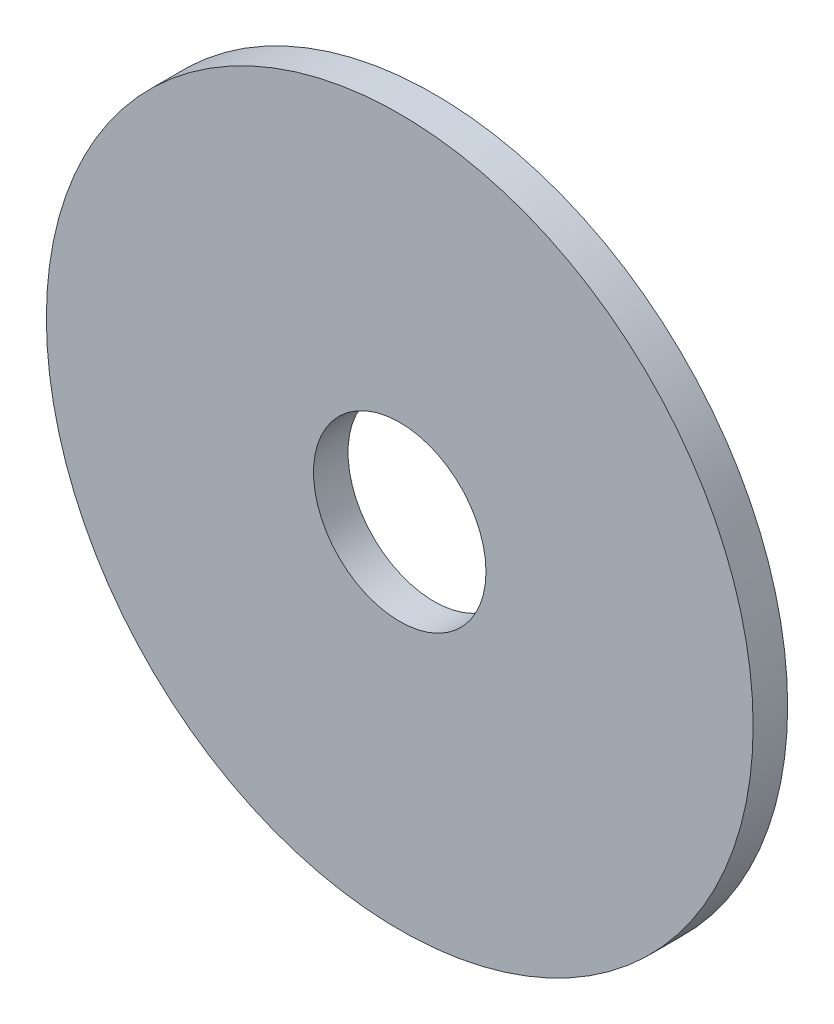
ISO-10303-21;
HEADER;
FILE_DESCRIPTION(('STEP AP214'),'2;1');
FILE_NAME('part.step','',(''),(''),'','','');
FILE_SCHEMA(('AUTOMOTIVE_DESIGN { 1 0 10303 214 1 1 1 1 }'));
ENDSEC;
DATA;
#1=APPLICATION_CONTEXT('core data for automotive mechanical design processes');
#2=APPLICATION_PROTOCOL_DEFINITION('international standard','automotive_design',2000,#1);
#3=PRODUCT_CONTEXT('',#1,'mechanical');
#4=PRODUCT('Part','Part','',(#3));
#5=PRODUCT_RELATED_PRODUCT_CATEGORY('part','',(#4));
#6=PRODUCT_DEFINITION_FORMATION('','',#4);
#7=PRODUCT_DEFINITION_CONTEXT('part definition',#1,'design');
#8=PRODUCT_DEFINITION('design','',#6,#7);
#9=PRODUCT_DEFINITION_SHAPE('','',#8);
#10=(LENGTH_UNIT() NAMED_UNIT(*) SI_UNIT(.MILLI.,.METRE.));
#11=(NAMED_UNIT(*) PLANE_ANGLE_UNIT() SI_UNIT($,.RADIAN.));
#12=(NAMED_UNIT(*) SI_UNIT($,.STERADIAN.) SOLID_ANGLE_UNIT());
#13=UNCERTAINTY_MEASURE_WITH_UNIT(LENGTH_MEASURE(1.E-05),#10,'distance_accuracy_value','');
#14=(GEOMETRIC_REPRESENTATION_CONTEXT(3) GLOBAL_UNCERTAINTY_ASSIGNED_CONTEXT((#13)) GLOBAL_UNIT_ASSIGNED_CONTEXT((#10,
#11,#12)) REPRESENTATION_CONTEXT('',''));
#15=CARTESIAN_POINT('',(0.,0.,0.));
#16=DIRECTION('',(0.,0.,1.));
#17=DIRECTION('',(1.,0.,0.));
#18=AXIS2_PLACEMENT_3D('',#15,#16,#17);
#19=CARTESIAN_POINT('',(0.,0.,-2.54));
#20=DIRECTION('',(0.,0.,-1.));
#21=DIRECTION('',(1.,0.,0.));
#22=AXIS2_PLACEMENT_3D('',#19,#20,#21);
#23=PLANE('',#22);
#24=CARTESIAN_POINT('',(0.,0.,-2.54));
#25=DIRECTION('',(0.,0.,1.));
#26=DIRECTION('',(1.,0.,0.));
#27=AXIS2_PLACEMENT_3D('',#24,#25,#26);
#28=CIRCLE('',#27,26.0223);
#29=CARTESIAN_POINT('',(26.0223,0.,-2.54));
#30=VERTEX_POINT('',#29);
#31=EDGE_CURVE('E10',#30,#30,#28,.T.);
#32=ORIENTED_EDGE('',*,*,#31,.F.);
#33=EDGE_LOOP('',(#32));
#34=FACE_BOUND('',#33,.T.);
#35=CARTESIAN_POINT('',(0.,0.,-2.54));
#36=DIRECTION('',(0.,0.,1.));
#37=DIRECTION('',(1.,0.,0.));
#38=AXIS2_PLACEMENT_3D('',#35,#36,#37);
#39=CIRCLE('',#38,6.35);
#40=CARTESIAN_POINT('',(6.35,0.,-2.54));
#41=VERTEX_POINT('',#40);
#42=EDGE_CURVE('E44',#41,#41,#39,.T.);
#43=ORIENTED_EDGE('',*,*,#42,.T.);
#44=EDGE_LOOP('',(#43));
#45=FACE_BOUND('',#44,.T.);
#46=ADVANCED_FACE('F33',(#34,#45),#23,.T.);
#47=CARTESIAN_POINT('',(0.,0.,0.));
#48=DIRECTION('',(0.,0.,-1.));
#49=DIRECTION('',(1.,0.,0.));
#50=AXIS2_PLACEMENT_3D('',#47,#48,#49);
#51=PLANE('',#50);
#52=CARTESIAN_POINT('',(0.,0.,0.));
#53=DIRECTION('',(0.,0.,1.));
#54=DIRECTION('',(1.,0.,0.));
#55=AXIS2_PLACEMENT_3D('',#52,#53,#54);
#56=CIRCLE('',#55,26.0223);
#57=CARTESIAN_POINT('',(26.0223,0.,0.));
#58=VERTEX_POINT('',#57);
#59=EDGE_CURVE('E37',#58,#58,#56,.T.);
#60=ORIENTED_EDGE('',*,*,#59,.T.);
#61=EDGE_LOOP('',(#60));
#62=FACE_BOUND('',#61,.T.);
#63=CARTESIAN_POINT('',(0.,0.,0.));
#64=DIRECTION('',(0.,0.,1.));
#65=DIRECTION('',(1.,0.,0.));
#66=AXIS2_PLACEMENT_3D('',#63,#64,#65);
#67=CIRCLE('',#66,6.35);
#68=CARTESIAN_POINT('',(6.35,0.,0.));
#69=VERTEX_POINT('',#68);
#70=EDGE_CURVE('E46',#69,#69,#67,.T.);
#71=ORIENTED_EDGE('',*,*,#70,.F.);
#72=EDGE_LOOP('',(#71));
#73=FACE_BOUND('',#72,.T.);
#74=ADVANCED_FACE('F59',(#62,#73),#51,.F.);
#75=CARTESIAN_POINT('',(0.,0.,-2.54));
#76=DIRECTION('',(0.,0.,1.));
#77=DIRECTION('',(-1.,0.,0.));
#78=AXIS2_PLACEMENT_3D('',#75,#76,#77);
#79=CYLINDRICAL_SURFACE('',#78,26.0223);
#80=ORIENTED_EDGE('',*,*,#31,.T.);
#81=EDGE_LOOP('',(#80));
#82=FACE_BOUND('',#81,.T.);
#83=ORIENTED_EDGE('',*,*,#59,.F.);
#84=EDGE_LOOP('',(#83));
#85=FACE_BOUND('',#84,.T.);
#86=ADVANCED_FACE('F35',(#82,#85),#79,.T.);
#87=CARTESIAN_POINT('',(0.,0.,-2.54));
#88=DIRECTION('',(0.,0.,1.));
#89=DIRECTION('',(-1.,0.,0.));
#90=AXIS2_PLACEMENT_3D('',#87,#88,#89);
#91=CYLINDRICAL_SURFACE('',#90,6.35);
#92=ORIENTED_EDGE('',*,*,#42,.F.);
#93=EDGE_LOOP('',(#92));
#94=FACE_BOUND('',#93,.T.);
#95=ORIENTED_EDGE('',*,*,#70,.T.);
#96=EDGE_LOOP('',(#95));
#97=FACE_BOUND('',#96,.T.);
#98=ADVANCED_FACE('F53',(#94,#97),#91,.F.);
#99=CLOSED_SHELL('',(#46,#74,#86,#98));
#100=MANIFOLD_SOLID_BREP('B2',#99);
#101=ADVANCED_BREP_SHAPE_REPRESENTATION('',(#18,#100),#14);
#102=SHAPE_DEFINITION_REPRESENTATION(#9,#101);
ENDSEC;
END-ISO-10303-21;
